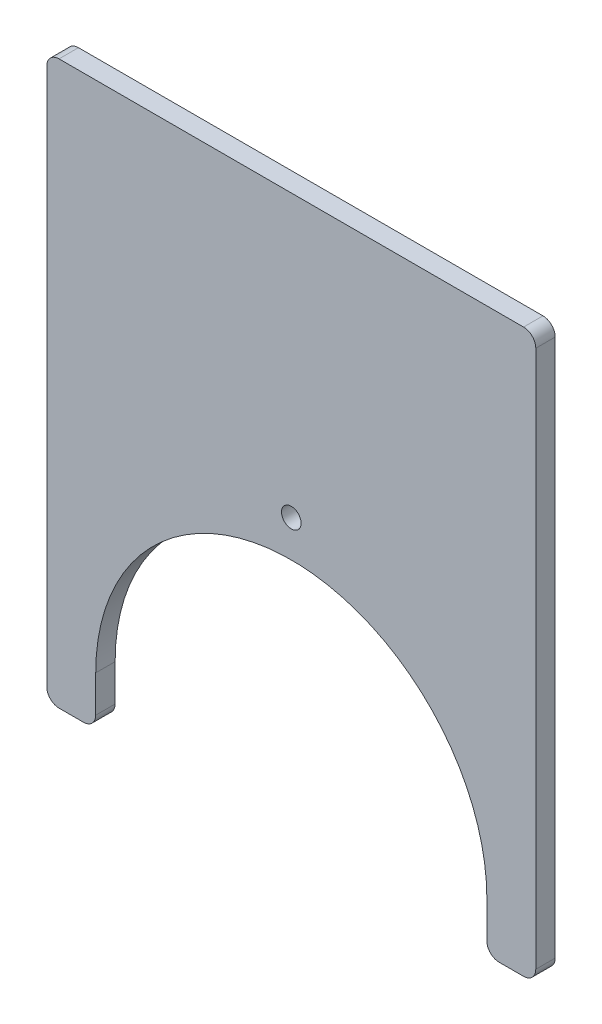
ISO-10303-21;
HEADER;
FILE_DESCRIPTION(('STEP AP214'),'2;1');
FILE_NAME('part.step','',(''),(''),'','','');
FILE_SCHEMA(('AUTOMOTIVE_DESIGN { 1 0 10303 214 1 1 1 1 }'));
ENDSEC;
DATA;
#1=APPLICATION_CONTEXT('core data for automotive mechanical design processes');
#2=APPLICATION_PROTOCOL_DEFINITION('international standard','automotive_design',2000,#1);
#3=PRODUCT_CONTEXT('',#1,'mechanical');
#4=PRODUCT('Part','Part','',(#3));
#5=PRODUCT_RELATED_PRODUCT_CATEGORY('part','',(#4));
#6=PRODUCT_DEFINITION_FORMATION('','',#4);
#7=PRODUCT_DEFINITION_CONTEXT('part definition',#1,'design');
#8=PRODUCT_DEFINITION('design','',#6,#7);
#9=PRODUCT_DEFINITION_SHAPE('','',#8);
#10=(LENGTH_UNIT() NAMED_UNIT(*) SI_UNIT(.MILLI.,.METRE.));
#11=(NAMED_UNIT(*) PLANE_ANGLE_UNIT() SI_UNIT($,.RADIAN.));
#12=(NAMED_UNIT(*) SI_UNIT($,.STERADIAN.) SOLID_ANGLE_UNIT());
#13=UNCERTAINTY_MEASURE_WITH_UNIT(LENGTH_MEASURE(1.E-05),#10,'distance_accuracy_value','');
#14=(GEOMETRIC_REPRESENTATION_CONTEXT(3) GLOBAL_UNCERTAINTY_ASSIGNED_CONTEXT((#13)) GLOBAL_UNIT_ASSIGNED_CONTEXT((#10,
#11,#12)) REPRESENTATION_CONTEXT('',''));
#15=CARTESIAN_POINT('',(0.,0.,0.));
#16=DIRECTION('',(0.,0.,1.));
#17=DIRECTION('',(1.,0.,0.));
#18=AXIS2_PLACEMENT_3D('',#15,#16,#17);
#19=CARTESIAN_POINT('',(-200.,-230.,-15.875));
#20=DIRECTION('',(0.,-1.,0.));
#21=DIRECTION('',(0.,0.,-1.));
#22=AXIS2_PLACEMENT_3D('',#19,#20,#21);
#23=PLANE('',#22);
#24=DIRECTION('',(1.,0.,0.));
#25=VECTOR('',#24,1.);
#26=CARTESIAN_POINT('',(-200.,-230.,-15.875));
#27=LINE('',#26,#25);
#28=CARTESIAN_POINT('',(-190.,-230.,-15.875));
#29=VERTEX_POINT('',#28);
#30=CARTESIAN_POINT('',(-170.,-230.,-15.875));
#31=VERTEX_POINT('',#30);
#32=EDGE_CURVE('E181',#29,#31,#27,.T.);
#33=ORIENTED_EDGE('',*,*,#32,.T.);
#34=DIRECTION('',(0.,0.,1.));
#35=VECTOR('',#34,1.);
#36=CARTESIAN_POINT('',(-170.,-230.,0.));
#37=LINE('',#36,#35);
#38=CARTESIAN_POINT('',(-170.,-230.,0.));
#39=VERTEX_POINT('',#38);
#40=EDGE_CURVE('E232',#31,#39,#37,.T.);
#41=ORIENTED_EDGE('',*,*,#40,.T.);
#42=DIRECTION('',(1.,0.,0.));
#43=VECTOR('',#42,1.);
#44=CARTESIAN_POINT('',(-200.,-230.,0.));
#45=LINE('',#44,#43);
#46=CARTESIAN_POINT('',(-190.,-230.,0.));
#47=VERTEX_POINT('',#46);
#48=EDGE_CURVE('E173',#47,#39,#45,.T.);
#49=ORIENTED_EDGE('',*,*,#48,.F.);
#50=DIRECTION('',(0.,0.,1.));
#51=VECTOR('',#50,1.);
#52=CARTESIAN_POINT('',(-190.,-230.,-15.875));
#53=LINE('',#52,#51);
#54=EDGE_CURVE('E230',#47,#29,#53,.F.);
#55=ORIENTED_EDGE('',*,*,#54,.T.);
#56=EDGE_LOOP('',(#33,#41,#49,#55));
#57=FACE_BOUND('',#56,.T.);
#58=ADVANCED_FACE('F33',(#57),#23,.T.);
#59=CARTESIAN_POINT('',(200.,230.,-15.875));
#60=DIRECTION('',(1.,0.,0.));
#61=DIRECTION('',(0.,1.,0.));
#62=AXIS2_PLACEMENT_3D('',#59,#60,#61);
#63=PLANE('',#62);
#64=DIRECTION('',(0.,1.,0.));
#65=VECTOR('',#64,1.);
#66=CARTESIAN_POINT('',(200.,230.,-15.875));
#67=LINE('',#66,#65);
#68=CARTESIAN_POINT('',(200.,-220.,-15.875));
#69=VERTEX_POINT('',#68);
#70=CARTESIAN_POINT('',(200.,220.,-15.875));
#71=VERTEX_POINT('',#70);
#72=EDGE_CURVE('E169',#69,#71,#67,.T.);
#73=ORIENTED_EDGE('',*,*,#72,.T.);
#74=DIRECTION('',(0.,0.,1.));
#75=VECTOR('',#74,1.);
#76=CARTESIAN_POINT('',(200.,220.,-15.875));
#77=LINE('',#76,#75);
#78=CARTESIAN_POINT('',(200.,220.,0.));
#79=VERTEX_POINT('',#78);
#80=EDGE_CURVE('E227',#71,#79,#77,.T.);
#81=ORIENTED_EDGE('',*,*,#80,.T.);
#82=DIRECTION('',(0.,1.,0.));
#83=VECTOR('',#82,1.);
#84=CARTESIAN_POINT('',(200.,230.,0.));
#85=LINE('',#84,#83);
#86=CARTESIAN_POINT('',(200.,-220.,0.));
#87=VERTEX_POINT('',#86);
#88=EDGE_CURVE('E167',#87,#79,#85,.T.);
#89=ORIENTED_EDGE('',*,*,#88,.F.);
#90=DIRECTION('',(0.,0.,1.));
#91=VECTOR('',#90,1.);
#92=CARTESIAN_POINT('',(200.,-220.,-15.875));
#93=LINE('',#92,#91);
#94=EDGE_CURVE('E225',#87,#69,#93,.F.);
#95=ORIENTED_EDGE('',*,*,#94,.T.);
#96=EDGE_LOOP('',(#73,#81,#89,#95));
#97=FACE_BOUND('',#96,.T.);
#98=ADVANCED_FACE('F262',(#97),#63,.T.);
#99=CARTESIAN_POINT('',(170.,-230.,0.));
#100=VERTEX_POINT('',#99);
#101=CARTESIAN_POINT('',(190.,-230.,0.));
#102=VERTEX_POINT('',#101);
#103=EDGE_CURVE('E190',#100,#102,#45,.T.);
#104=ORIENTED_EDGE('',*,*,#103,.F.);
#105=DIRECTION('',(0.,0.,1.));
#106=VECTOR('',#105,1.);
#107=CARTESIAN_POINT('',(170.,-230.,-15.875));
#108=LINE('',#107,#106);
#109=CARTESIAN_POINT('',(170.,-230.,-15.875));
#110=VERTEX_POINT('',#109);
#111=EDGE_CURVE('E11',#100,#110,#108,.F.);
#112=ORIENTED_EDGE('',*,*,#111,.T.);
#113=CARTESIAN_POINT('',(190.,-230.,-15.875));
#114=VERTEX_POINT('',#113);
#115=EDGE_CURVE('E179',#110,#114,#27,.T.);
#116=ORIENTED_EDGE('',*,*,#115,.T.);
#117=DIRECTION('',(0.,0.,1.));
#118=VECTOR('',#117,1.);
#119=CARTESIAN_POINT('',(190.,-230.,-15.875));
#120=LINE('',#119,#118);
#121=EDGE_CURVE('E41',#114,#102,#120,.T.);
#122=ORIENTED_EDGE('',*,*,#121,.T.);
#123=EDGE_LOOP('',(#104,#112,#116,#122));
#124=FACE_BOUND('',#123,.T.);
#125=ADVANCED_FACE('F243',(#124),#23,.T.);
#126=CARTESIAN_POINT('',(-200.,230.,-15.875));
#127=DIRECTION('',(-1.,0.,0.));
#128=DIRECTION('',(0.,-1.,0.));
#129=AXIS2_PLACEMENT_3D('',#126,#127,#128);
#130=PLANE('',#129);
#131=DIRECTION('',(0.,-1.,0.));
#132=VECTOR('',#131,1.);
#133=CARTESIAN_POINT('',(-200.,230.,0.));
#134=LINE('',#133,#132);
#135=CARTESIAN_POINT('',(-200.,220.,0.));
#136=VERTEX_POINT('',#135);
#137=CARTESIAN_POINT('',(-200.,-220.,0.));
#138=VERTEX_POINT('',#137);
#139=EDGE_CURVE('E187',#136,#138,#134,.T.);
#140=ORIENTED_EDGE('',*,*,#139,.F.);
#141=DIRECTION('',(0.,0.,1.));
#142=VECTOR('',#141,1.);
#143=CARTESIAN_POINT('',(-200.,220.,-15.875));
#144=LINE('',#143,#142);
#145=CARTESIAN_POINT('',(-200.,220.,-15.875));
#146=VERTEX_POINT('',#145);
#147=EDGE_CURVE('E213',#136,#146,#144,.F.);
#148=ORIENTED_EDGE('',*,*,#147,.T.);
#149=DIRECTION('',(0.,-1.,0.));
#150=VECTOR('',#149,1.);
#151=CARTESIAN_POINT('',(-200.,230.,-15.875));
#152=LINE('',#151,#150);
#153=CARTESIAN_POINT('',(-200.,-220.,-15.875));
#154=VERTEX_POINT('',#153);
#155=EDGE_CURVE('E176',#146,#154,#152,.T.);
#156=ORIENTED_EDGE('',*,*,#155,.T.);
#157=DIRECTION('',(0.,0.,1.));
#158=VECTOR('',#157,1.);
#159=CARTESIAN_POINT('',(-200.,-220.,-15.875));
#160=LINE('',#159,#158);
#161=EDGE_CURVE('E210',#154,#138,#160,.T.);
#162=ORIENTED_EDGE('',*,*,#161,.T.);
#163=EDGE_LOOP('',(#140,#148,#156,#162));
#164=FACE_BOUND('',#163,.T.);
#165=ADVANCED_FACE('F274',(#164),#130,.T.);
#166=CARTESIAN_POINT('',(-200.,230.,-15.875));
#167=DIRECTION('',(0.,1.,0.));
#168=DIRECTION('',(0.,0.,1.));
#169=AXIS2_PLACEMENT_3D('',#166,#167,#168);
#170=PLANE('',#169);
#171=DIRECTION('',(-1.,0.,0.));
#172=VECTOR('',#171,1.);
#173=CARTESIAN_POINT('',(-200.,230.,-15.875));
#174=LINE('',#173,#172);
#175=CARTESIAN_POINT('',(190.,230.,-15.875));
#176=VERTEX_POINT('',#175);
#177=CARTESIAN_POINT('',(-190.,230.,-15.875));
#178=VERTEX_POINT('',#177);
#179=EDGE_CURVE('E172',#176,#178,#174,.T.);
#180=ORIENTED_EDGE('',*,*,#179,.T.);
#181=DIRECTION('',(0.,0.,1.));
#182=VECTOR('',#181,1.);
#183=CARTESIAN_POINT('',(-190.,230.,-15.875));
#184=LINE('',#183,#182);
#185=CARTESIAN_POINT('',(-190.,230.,0.));
#186=VERTEX_POINT('',#185);
#187=EDGE_CURVE('E195',#178,#186,#184,.T.);
#188=ORIENTED_EDGE('',*,*,#187,.T.);
#189=DIRECTION('',(-1.,0.,0.));
#190=VECTOR('',#189,1.);
#191=CARTESIAN_POINT('',(-200.,230.,0.));
#192=LINE('',#191,#190);
#193=CARTESIAN_POINT('',(190.,230.,0.));
#194=VERTEX_POINT('',#193);
#195=EDGE_CURVE('E184',#194,#186,#192,.T.);
#196=ORIENTED_EDGE('',*,*,#195,.F.);
#197=DIRECTION('',(0.,0.,1.));
#198=VECTOR('',#197,1.);
#199=CARTESIAN_POINT('',(190.,230.,-15.875));
#200=LINE('',#199,#198);
#201=EDGE_CURVE('E193',#194,#176,#200,.F.);
#202=ORIENTED_EDGE('',*,*,#201,.T.);
#203=EDGE_LOOP('',(#180,#188,#196,#202));
#204=FACE_BOUND('',#203,.T.);
#205=ADVANCED_FACE('F278',(#204),#170,.T.);
#206=CARTESIAN_POINT('',(0.,0.,-15.875));
#207=DIRECTION('',(0.,0.,1.));
#208=DIRECTION('',(1.,0.,0.));
#209=AXIS2_PLACEMENT_3D('',#206,#207,#208);
#210=PLANE('',#209);
#211=CARTESIAN_POINT('',(0.,0.,-15.875));
#212=DIRECTION('',(0.,0.,1.));
#213=DIRECTION('',(1.,0.,0.));
#214=AXIS2_PLACEMENT_3D('',#211,#212,#213);
#215=CIRCLE('',#214,8.);
#216=CARTESIAN_POINT('',(8.,0.,-15.875));
#217=VERTEX_POINT('',#216);
#218=EDGE_CURVE('E163',#217,#217,#215,.T.);
#219=ORIENTED_EDGE('',*,*,#218,.T.);
#220=EDGE_LOOP('',(#219));
#221=FACE_BOUND('',#220,.T.);
#222=ORIENTED_EDGE('',*,*,#155,.F.);
#223=CARTESIAN_POINT('',(-190.,220.,-15.875));
#224=DIRECTION('',(0.,0.,1.));
#225=DIRECTION('',(1.,0.,0.));
#226=AXIS2_PLACEMENT_3D('',#223,#224,#225);
#227=CIRCLE('',#226,10.);
#228=EDGE_CURVE('E223',#146,#178,#227,.F.);
#229=ORIENTED_EDGE('',*,*,#228,.T.);
#230=ORIENTED_EDGE('',*,*,#179,.F.);
#231=CARTESIAN_POINT('',(190.,220.,-15.875));
#232=DIRECTION('',(0.,0.,1.));
#233=DIRECTION('',(1.,0.,0.));
#234=AXIS2_PLACEMENT_3D('',#231,#232,#233);
#235=CIRCLE('',#234,10.);
#236=EDGE_CURVE('E221',#176,#71,#235,.F.);
#237=ORIENTED_EDGE('',*,*,#236,.T.);
#238=ORIENTED_EDGE('',*,*,#72,.F.);
#239=CARTESIAN_POINT('',(190.,-220.,-15.875));
#240=DIRECTION('',(0.,0.,1.));
#241=DIRECTION('',(1.,0.,0.));
#242=AXIS2_PLACEMENT_3D('',#239,#240,#241);
#243=CIRCLE('',#242,10.);
#244=EDGE_CURVE('E54',#69,#114,#243,.F.);
#245=ORIENTED_EDGE('',*,*,#244,.T.);
#246=ORIENTED_EDGE('',*,*,#115,.F.);
#247=CARTESIAN_POINT('',(170.,-220.,-15.875));
#248=DIRECTION('',(0.,0.,1.));
#249=DIRECTION('',(1.,0.,0.));
#250=AXIS2_PLACEMENT_3D('',#247,#248,#249);
#251=CIRCLE('',#250,10.);
#252=CARTESIAN_POINT('',(160.,-220.,-15.875));
#253=VERTEX_POINT('',#252);
#254=EDGE_CURVE('E48',#110,#253,#251,.F.);
#255=ORIENTED_EDGE('',*,*,#254,.T.);
#256=DIRECTION('',(0.,1.,0.));
#257=VECTOR('',#256,1.);
#258=CARTESIAN_POINT('',(160.,-230.,-15.875));
#259=LINE('',#258,#257);
#260=CARTESIAN_POINT('',(160.,-190.,-15.875));
#261=VERTEX_POINT('',#260);
#262=EDGE_CURVE('E132',#253,#261,#259,.T.);
#263=ORIENTED_EDGE('',*,*,#262,.T.);
#264=CARTESIAN_POINT('',(0.,-190.,-15.875));
#265=DIRECTION('',(0.,0.,1.));
#266=DIRECTION('',(1.,0.,0.));
#267=AXIS2_PLACEMENT_3D('',#264,#265,#266);
#268=CIRCLE('',#267,160.);
#269=CARTESIAN_POINT('',(-160.,-190.,-15.875));
#270=VERTEX_POINT('',#269);
#271=EDGE_CURVE('E138',#261,#270,#268,.T.);
#272=ORIENTED_EDGE('',*,*,#271,.T.);
#273=DIRECTION('',(0.,-1.,0.));
#274=VECTOR('',#273,1.);
#275=CARTESIAN_POINT('',(-160.,-230.,-15.875));
#276=LINE('',#275,#274);
#277=CARTESIAN_POINT('',(-160.,-220.,-15.875));
#278=VERTEX_POINT('',#277);
#279=EDGE_CURVE('E153',#270,#278,#276,.T.);
#280=ORIENTED_EDGE('',*,*,#279,.T.);
#281=CARTESIAN_POINT('',(-170.,-220.,-15.875));
#282=DIRECTION('',(0.,0.,1.));
#283=DIRECTION('',(1.,0.,0.));
#284=AXIS2_PLACEMENT_3D('',#281,#282,#283);
#285=CIRCLE('',#284,10.);
#286=EDGE_CURVE('E219',#278,#31,#285,.F.);
#287=ORIENTED_EDGE('',*,*,#286,.T.);
#288=ORIENTED_EDGE('',*,*,#32,.F.);
#289=CARTESIAN_POINT('',(-190.,-220.,-15.875));
#290=DIRECTION('',(0.,0.,1.));
#291=DIRECTION('',(1.,0.,0.));
#292=AXIS2_PLACEMENT_3D('',#289,#290,#291);
#293=CIRCLE('',#292,10.);
#294=EDGE_CURVE('E217',#29,#154,#293,.F.);
#295=ORIENTED_EDGE('',*,*,#294,.T.);
#296=EDGE_LOOP('',(#222,#229,#230,#237,#238,#245,#246,#255,#263,#272,#280,#287,#288,#295));
#297=FACE_BOUND('',#296,.T.);
#298=ADVANCED_FACE('F135',(#221,#297),#210,.F.);
#299=CARTESIAN_POINT('',(0.,0.,0.));
#300=DIRECTION('',(0.,0.,1.));
#301=DIRECTION('',(1.,0.,0.));
#302=AXIS2_PLACEMENT_3D('',#299,#300,#301);
#303=PLANE('',#302);
#304=CARTESIAN_POINT('',(0.,0.,0.));
#305=DIRECTION('',(0.,0.,1.));
#306=DIRECTION('',(1.,0.,0.));
#307=AXIS2_PLACEMENT_3D('',#304,#305,#306);
#308=CIRCLE('',#307,8.);
#309=CARTESIAN_POINT('',(8.,0.,0.));
#310=VERTEX_POINT('',#309);
#311=EDGE_CURVE('E338',#310,#310,#308,.T.);
#312=ORIENTED_EDGE('',*,*,#311,.F.);
#313=EDGE_LOOP('',(#312));
#314=FACE_BOUND('',#313,.T.);
#315=ORIENTED_EDGE('',*,*,#195,.T.);
#316=CARTESIAN_POINT('',(-190.,220.,0.));
#317=DIRECTION('',(0.,0.,1.));
#318=DIRECTION('',(1.,0.,0.));
#319=AXIS2_PLACEMENT_3D('',#316,#317,#318);
#320=CIRCLE('',#319,10.);
#321=EDGE_CURVE('E208',#186,#136,#320,.T.);
#322=ORIENTED_EDGE('',*,*,#321,.T.);
#323=ORIENTED_EDGE('',*,*,#139,.T.);
#324=CARTESIAN_POINT('',(-190.,-220.,0.));
#325=DIRECTION('',(0.,0.,1.));
#326=DIRECTION('',(1.,0.,0.));
#327=AXIS2_PLACEMENT_3D('',#324,#325,#326);
#328=CIRCLE('',#327,10.);
#329=EDGE_CURVE('E202',#138,#47,#328,.T.);
#330=ORIENTED_EDGE('',*,*,#329,.T.);
#331=ORIENTED_EDGE('',*,*,#48,.T.);
#332=CARTESIAN_POINT('',(-170.,-220.,0.));
#333=DIRECTION('',(0.,0.,1.));
#334=DIRECTION('',(1.,0.,0.));
#335=AXIS2_PLACEMENT_3D('',#332,#333,#334);
#336=CIRCLE('',#335,10.);
#337=CARTESIAN_POINT('',(-160.,-220.,0.));
#338=VERTEX_POINT('',#337);
#339=EDGE_CURVE('E204',#39,#338,#336,.T.);
#340=ORIENTED_EDGE('',*,*,#339,.T.);
#341=DIRECTION('',(0.,-1.,0.));
#342=VECTOR('',#341,1.);
#343=CARTESIAN_POINT('',(-160.,-230.,0.));
#344=LINE('',#343,#342);
#345=CARTESIAN_POINT('',(-160.,-190.,0.));
#346=VERTEX_POINT('',#345);
#347=EDGE_CURVE('E142',#346,#338,#344,.T.);
#348=ORIENTED_EDGE('',*,*,#347,.F.);
#349=CARTESIAN_POINT('',(0.,-190.,0.));
#350=DIRECTION('',(0.,0.,1.));
#351=DIRECTION('',(1.,0.,0.));
#352=AXIS2_PLACEMENT_3D('',#349,#350,#351);
#353=CIRCLE('',#352,160.);
#354=CARTESIAN_POINT('',(160.,-190.,0.));
#355=VERTEX_POINT('',#354);
#356=EDGE_CURVE('E162',#355,#346,#353,.T.);
#357=ORIENTED_EDGE('',*,*,#356,.F.);
#358=DIRECTION('',(0.,1.,0.));
#359=VECTOR('',#358,1.);
#360=CARTESIAN_POINT('',(160.,-230.,0.));
#361=LINE('',#360,#359);
#362=CARTESIAN_POINT('',(160.,-220.,0.));
#363=VERTEX_POINT('',#362);
#364=EDGE_CURVE('E148',#363,#355,#361,.T.);
#365=ORIENTED_EDGE('',*,*,#364,.F.);
#366=CARTESIAN_POINT('',(170.,-220.,0.));
#367=DIRECTION('',(0.,0.,1.));
#368=DIRECTION('',(1.,0.,0.));
#369=AXIS2_PLACEMENT_3D('',#366,#367,#368);
#370=CIRCLE('',#369,10.);
#371=EDGE_CURVE('E200',#363,#100,#370,.T.);
#372=ORIENTED_EDGE('',*,*,#371,.T.);
#373=ORIENTED_EDGE('',*,*,#103,.T.);
#374=CARTESIAN_POINT('',(190.,-220.,0.));
#375=DIRECTION('',(0.,0.,1.));
#376=DIRECTION('',(1.,0.,0.));
#377=AXIS2_PLACEMENT_3D('',#374,#375,#376);
#378=CIRCLE('',#377,10.);
#379=EDGE_CURVE('E198',#102,#87,#378,.T.);
#380=ORIENTED_EDGE('',*,*,#379,.T.);
#381=ORIENTED_EDGE('',*,*,#88,.T.);
#382=CARTESIAN_POINT('',(190.,220.,0.));
#383=DIRECTION('',(0.,0.,1.));
#384=DIRECTION('',(1.,0.,0.));
#385=AXIS2_PLACEMENT_3D('',#382,#383,#384);
#386=CIRCLE('',#385,10.);
#387=EDGE_CURVE('E206',#79,#194,#386,.T.);
#388=ORIENTED_EDGE('',*,*,#387,.T.);
#389=EDGE_LOOP('',(#315,#322,#323,#330,#331,#340,#348,#357,#365,#372,#373,#380,#381,#388));
#390=FACE_BOUND('',#389,.T.);
#391=ADVANCED_FACE('F247',(#314,#390),#303,.T.);
#392=CARTESIAN_POINT('',(-160.,-230.,-15.875));
#393=DIRECTION('',(-1.,0.,0.));
#394=DIRECTION('',(0.,-1.,0.));
#395=AXIS2_PLACEMENT_3D('',#392,#393,#394);
#396=PLANE('',#395);
#397=ORIENTED_EDGE('',*,*,#347,.T.);
#398=DIRECTION('',(0.,0.,1.));
#399=VECTOR('',#398,1.);
#400=CARTESIAN_POINT('',(-160.,-220.,-15.875));
#401=LINE('',#400,#399);
#402=EDGE_CURVE('E235',#338,#278,#401,.F.);
#403=ORIENTED_EDGE('',*,*,#402,.T.);
#404=ORIENTED_EDGE('',*,*,#279,.F.);
#405=DIRECTION('',(0.,0.,1.));
#406=VECTOR('',#405,1.);
#407=CARTESIAN_POINT('',(-160.,-190.,-15.875));
#408=LINE('',#407,#406);
#409=EDGE_CURVE('E152',#270,#346,#408,.T.);
#410=ORIENTED_EDGE('',*,*,#409,.T.);
#411=EDGE_LOOP('',(#397,#403,#404,#410));
#412=FACE_BOUND('',#411,.T.);
#413=ADVANCED_FACE('F318',(#412),#396,.F.);
#414=CARTESIAN_POINT('',(0.,-190.,-15.875));
#415=DIRECTION('',(0.,0.,1.));
#416=DIRECTION('',(1.,0.,0.));
#417=AXIS2_PLACEMENT_3D('',#414,#415,#416);
#418=CYLINDRICAL_SURFACE('',#417,160.);
#419=ORIENTED_EDGE('',*,*,#356,.T.);
#420=ORIENTED_EDGE('',*,*,#409,.F.);
#421=ORIENTED_EDGE('',*,*,#271,.F.);
#422=DIRECTION('',(0.,0.,1.));
#423=VECTOR('',#422,1.);
#424=CARTESIAN_POINT('',(160.,-190.,-15.875));
#425=LINE('',#424,#423);
#426=EDGE_CURVE('E145',#261,#355,#425,.T.);
#427=ORIENTED_EDGE('',*,*,#426,.T.);
#428=EDGE_LOOP('',(#419,#420,#421,#427));
#429=FACE_BOUND('',#428,.T.);
#430=ADVANCED_FACE('F155',(#429),#418,.F.);
#431=CARTESIAN_POINT('',(160.,-230.,-15.875));
#432=DIRECTION('',(1.,0.,0.));
#433=DIRECTION('',(0.,1.,0.));
#434=AXIS2_PLACEMENT_3D('',#431,#432,#433);
#435=PLANE('',#434);
#436=ORIENTED_EDGE('',*,*,#262,.F.);
#437=DIRECTION('',(0.,0.,1.));
#438=VECTOR('',#437,1.);
#439=CARTESIAN_POINT('',(160.,-220.,0.));
#440=LINE('',#439,#438);
#441=EDGE_CURVE('E237',#253,#363,#440,.T.);
#442=ORIENTED_EDGE('',*,*,#441,.T.);
#443=ORIENTED_EDGE('',*,*,#364,.T.);
#444=ORIENTED_EDGE('',*,*,#426,.F.);
#445=EDGE_LOOP('',(#436,#442,#443,#444));
#446=FACE_BOUND('',#445,.T.);
#447=ADVANCED_FACE('F146',(#446),#435,.F.);
#448=CARTESIAN_POINT('',(-190.,220.,-15.875));
#449=DIRECTION('',(0.,0.,1.));
#450=DIRECTION('',(1.,0.,0.));
#451=AXIS2_PLACEMENT_3D('',#448,#449,#450);
#452=CYLINDRICAL_SURFACE('',#451,10.);
#453=ORIENTED_EDGE('',*,*,#228,.F.);
#454=ORIENTED_EDGE('',*,*,#147,.F.);
#455=ORIENTED_EDGE('',*,*,#321,.F.);
#456=ORIENTED_EDGE('',*,*,#187,.F.);
#457=EDGE_LOOP('',(#453,#454,#455,#456));
#458=FACE_BOUND('',#457,.T.);
#459=ADVANCED_FACE('F287',(#458),#452,.T.);
#460=CARTESIAN_POINT('',(190.,220.,-15.875));
#461=DIRECTION('',(0.,0.,1.));
#462=DIRECTION('',(1.,0.,0.));
#463=AXIS2_PLACEMENT_3D('',#460,#461,#462);
#464=CYLINDRICAL_SURFACE('',#463,10.);
#465=ORIENTED_EDGE('',*,*,#236,.F.);
#466=ORIENTED_EDGE('',*,*,#201,.F.);
#467=ORIENTED_EDGE('',*,*,#387,.F.);
#468=ORIENTED_EDGE('',*,*,#80,.F.);
#469=EDGE_LOOP('',(#465,#466,#467,#468));
#470=FACE_BOUND('',#469,.T.);
#471=ADVANCED_FACE('F290',(#470),#464,.T.);
#472=CARTESIAN_POINT('',(-170.,-220.,-15.875));
#473=DIRECTION('',(0.,0.,-1.));
#474=DIRECTION('',(-1.,0.,0.));
#475=AXIS2_PLACEMENT_3D('',#472,#473,#474);
#476=CYLINDRICAL_SURFACE('',#475,10.);
#477=ORIENTED_EDGE('',*,*,#286,.F.);
#478=ORIENTED_EDGE('',*,*,#402,.F.);
#479=ORIENTED_EDGE('',*,*,#339,.F.);
#480=ORIENTED_EDGE('',*,*,#40,.F.);
#481=EDGE_LOOP('',(#477,#478,#479,#480));
#482=FACE_BOUND('',#481,.T.);
#483=ADVANCED_FACE('F258',(#482),#476,.T.);
#484=CARTESIAN_POINT('',(-190.,-220.,-15.875));
#485=DIRECTION('',(0.,0.,1.));
#486=DIRECTION('',(1.,0.,0.));
#487=AXIS2_PLACEMENT_3D('',#484,#485,#486);
#488=CYLINDRICAL_SURFACE('',#487,10.);
#489=ORIENTED_EDGE('',*,*,#294,.F.);
#490=ORIENTED_EDGE('',*,*,#54,.F.);
#491=ORIENTED_EDGE('',*,*,#329,.F.);
#492=ORIENTED_EDGE('',*,*,#161,.F.);
#493=EDGE_LOOP('',(#489,#490,#491,#492));
#494=FACE_BOUND('',#493,.T.);
#495=ADVANCED_FACE('F252',(#494),#488,.T.);
#496=CARTESIAN_POINT('',(170.,-220.,-15.875));
#497=DIRECTION('',(0.,0.,-1.));
#498=DIRECTION('',(-1.,0.,0.));
#499=AXIS2_PLACEMENT_3D('',#496,#497,#498);
#500=CYLINDRICAL_SURFACE('',#499,10.);
#501=ORIENTED_EDGE('',*,*,#254,.F.);
#502=ORIENTED_EDGE('',*,*,#111,.F.);
#503=ORIENTED_EDGE('',*,*,#371,.F.);
#504=ORIENTED_EDGE('',*,*,#441,.F.);
#505=EDGE_LOOP('',(#501,#502,#503,#504));
#506=FACE_BOUND('',#505,.T.);
#507=ADVANCED_FACE('F250',(#506),#500,.T.);
#508=CARTESIAN_POINT('',(190.,-220.,-15.875));
#509=DIRECTION('',(0.,0.,1.));
#510=DIRECTION('',(1.,0.,0.));
#511=AXIS2_PLACEMENT_3D('',#508,#509,#510);
#512=CYLINDRICAL_SURFACE('',#511,10.);
#513=ORIENTED_EDGE('',*,*,#244,.F.);
#514=ORIENTED_EDGE('',*,*,#94,.F.);
#515=ORIENTED_EDGE('',*,*,#379,.F.);
#516=ORIENTED_EDGE('',*,*,#121,.F.);
#517=EDGE_LOOP('',(#513,#514,#515,#516));
#518=FACE_BOUND('',#517,.T.);
#519=ADVANCED_FACE('F35',(#518),#512,.T.);
#520=CARTESIAN_POINT('',(0.,0.,-15.875));
#521=DIRECTION('',(0.,0.,1.));
#522=DIRECTION('',(1.,0.,0.));
#523=AXIS2_PLACEMENT_3D('',#520,#521,#522);
#524=CYLINDRICAL_SURFACE('',#523,8.);
#525=ORIENTED_EDGE('',*,*,#218,.F.);
#526=EDGE_LOOP('',(#525));
#527=FACE_BOUND('',#526,.T.);
#528=ORIENTED_EDGE('',*,*,#311,.T.);
#529=EDGE_LOOP('',(#528));
#530=FACE_BOUND('',#529,.T.);
#531=ADVANCED_FACE('F257',(#527,#530),#524,.F.);
#532=CLOSED_SHELL('',(#58,#98,#125,#165,#205,#298,#391,#413,#430,#447,#459,#471,#483,#495,#507,
#519,#531));
#533=MANIFOLD_SOLID_BREP('B2',#532);
#534=ADVANCED_BREP_SHAPE_REPRESENTATION('',(#18,#533),#14);
#535=SHAPE_DEFINITION_REPRESENTATION(#9,#534);
ENDSEC;
END-ISO-10303-21;
